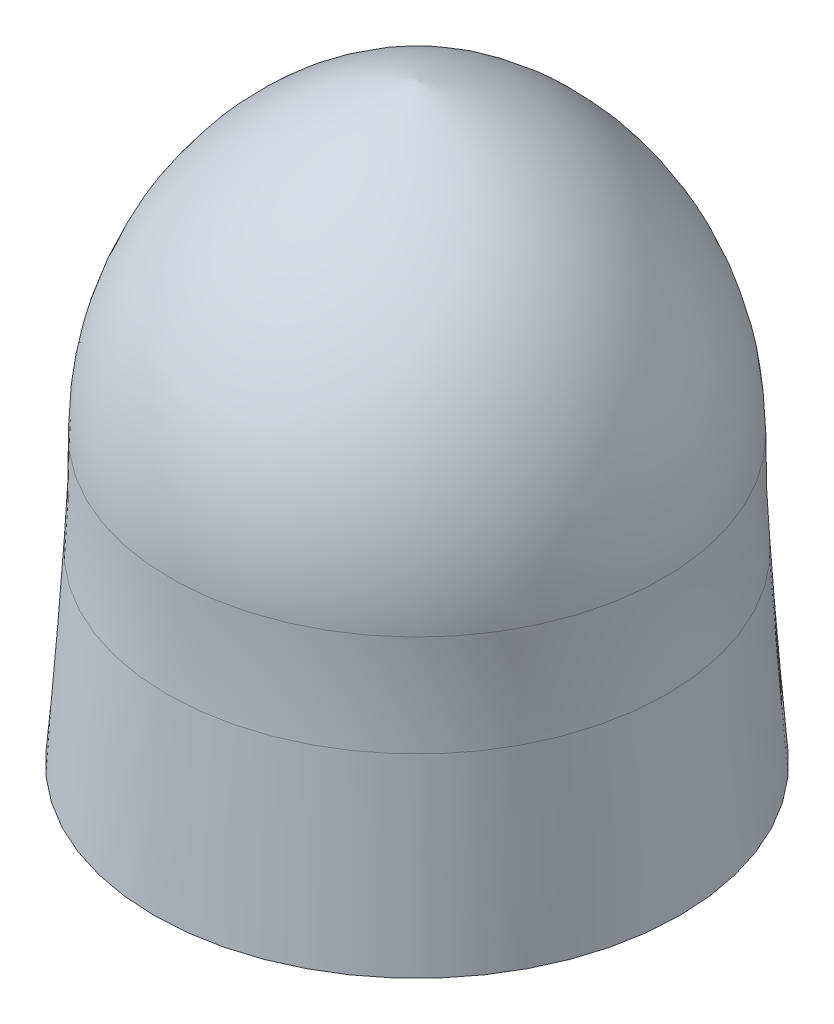
ISO-10303-21;
HEADER;
FILE_DESCRIPTION(('STEP AP214'),'2;1');
FILE_NAME('part.step','',(''),(''),'','','');
FILE_SCHEMA(('AUTOMOTIVE_DESIGN { 1 0 10303 214 1 1 1 1 }'));
ENDSEC;
DATA;
#1=APPLICATION_CONTEXT('core data for automotive mechanical design processes');
#2=APPLICATION_PROTOCOL_DEFINITION('international standard','automotive_design',2000,#1);
#3=PRODUCT_CONTEXT('',#1,'mechanical');
#4=PRODUCT('Part','Part','',(#3));
#5=PRODUCT_RELATED_PRODUCT_CATEGORY('part','',(#4));
#6=PRODUCT_DEFINITION_FORMATION('','',#4);
#7=PRODUCT_DEFINITION_CONTEXT('part definition',#1,'design');
#8=PRODUCT_DEFINITION('design','',#6,#7);
#9=PRODUCT_DEFINITION_SHAPE('','',#8);
#10=(LENGTH_UNIT() NAMED_UNIT(*) SI_UNIT(.MILLI.,.METRE.));
#11=(NAMED_UNIT(*) PLANE_ANGLE_UNIT() SI_UNIT($,.RADIAN.));
#12=(NAMED_UNIT(*) SI_UNIT($,.STERADIAN.) SOLID_ANGLE_UNIT());
#13=UNCERTAINTY_MEASURE_WITH_UNIT(LENGTH_MEASURE(1.E-05),#10,'distance_accuracy_value','');
#14=(GEOMETRIC_REPRESENTATION_CONTEXT(3) GLOBAL_UNCERTAINTY_ASSIGNED_CONTEXT((#13)) GLOBAL_UNIT_ASSIGNED_CONTEXT((#10,
#11,#12)) REPRESENTATION_CONTEXT('',''));
#15=CARTESIAN_POINT('',(0.,0.,0.));
#16=DIRECTION('',(0.,0.,1.));
#17=DIRECTION('',(1.,0.,0.));
#18=AXIS2_PLACEMENT_3D('',#15,#16,#17);
#19=CARTESIAN_POINT('',(10.,-46.48316129116,0.));
#20=DIRECTION('',(0.,0.,-1.));
#21=DIRECTION('',(-1.,0.,0.));
#22=AXIS2_PLACEMENT_3D('',#19,#20,#21);
#23=CIRCLE('',#22,47.5466537583876);
#24=TRIMMED_CURVE('',#23,(PARAMETER_VALUE(-1.35889432008498)),
(PARAMETER_VALUE(1.35889432008498)),.T.,.PARAMETER.);
#25=CARTESIAN_POINT('',(0.,-46.48316129116,0.));
#26=DIRECTION('',(0.,1.,0.));
#27=AXIS1_PLACEMENT('',#25,#26);
#28=SURFACE_OF_REVOLUTION('',#24,#27);
#29=CARTESIAN_POINT('',(0.,-46.7505656060775,0.));
#30=DIRECTION('',(0.,1.,0.));
#31=DIRECTION('',(-1.,0.,0.));
#32=AXIS2_PLACEMENT_3D('',#29,#30,#31);
#33=CIRCLE('',#32,37.545901806069);
#34=CARTESIAN_POINT('',(-37.545901806069,-46.7505656060775,0.));
#35=VERTEX_POINT('',#34);
#36=EDGE_CURVE('E42',#35,#35,#33,.T.);
#37=ORIENTED_EDGE('',*,*,#36,.T.);
#38=EDGE_LOOP('',(#37));
#39=FACE_BOUND('',#38,.T.);
#40=CARTESIAN_POINT('',(0.,0.,0.));
#41=VERTEX_POINT('',#40);
#42=VERTEX_LOOP('',#41);
#43=FACE_BOUND('',#42,.T.);
#44=ADVANCED_FACE('F35',(#39,#43),#28,.T.);
#45=CARTESIAN_POINT('',(0.,-51.3476055698832,0.));
#46=DIRECTION('',(0.,-1.,0.));
#47=DIRECTION('',(1.,0.,0.));
#48=AXIS2_PLACEMENT_3D('',#45,#46,#47);
#49=CONICAL_SURFACE('',#48,37.2971612835188,0.0698131700797734);
#50=CARTESIAN_POINT('',(0.,-61.8266684908287,0.));
#51=DIRECTION('',(0.,-1.,0.));
#52=DIRECTION('',(1.,0.,0.));
#53=AXIS2_PLACEMENT_3D('',#50,#51,#52);
#54=CIRCLE('',#53,38.029928745736);
#55=CARTESIAN_POINT('',(38.029928745736,-61.8266684908287,0.));
#56=VERTEX_POINT('',#55);
#57=EDGE_CURVE('E11',#56,#56,#54,.T.);
#58=ORIENTED_EDGE('',*,*,#57,.T.);
#59=EDGE_LOOP('',(#58));
#60=FACE_BOUND('',#59,.T.);
#61=CARTESIAN_POINT('',(0.,-90.,0.));
#62=DIRECTION('',(0.,1.,0.));
#63=DIRECTION('',(-1.,0.,0.));
#64=AXIS2_PLACEMENT_3D('',#61,#62,#63);
#65=CIRCLE('',#64,40.);
#66=CARTESIAN_POINT('',(-40.,-90.,0.));
#67=VERTEX_POINT('',#66);
#68=EDGE_CURVE('E64',#67,#67,#65,.T.);
#69=ORIENTED_EDGE('',*,*,#68,.T.);
#70=EDGE_LOOP('',(#69));
#71=FACE_BOUND('',#70,.T.);
#72=ADVANCED_FACE('F46',(#60,#71),#49,.T.);
#73=CARTESIAN_POINT('',(-40.,-90.,0.));
#74=DIRECTION('',(0.,-1.,0.));
#75=DIRECTION('',(1.,0.,0.));
#76=AXIS2_PLACEMENT_3D('',#73,#74,#75);
#77=PLANE('',#76);
#78=ORIENTED_EDGE('',*,*,#68,.F.);
#79=EDGE_LOOP('',(#78));
#80=FACE_BOUND('',#79,.T.);
#81=ADVANCED_FACE('F51',(#80),#77,.T.);
#82=CARTESIAN_POINT('',(0.,-47.8753737420037,0.));
#83=DIRECTION('',(0.,1.,0.));
#84=DIRECTION('',(-1.,0.,0.));
#85=AXIS2_PLACEMENT_3D('',#82,#83,#84);
#86=TOROIDAL_SURFACE('',#85,237.542738797701,200.);
#87=ORIENTED_EDGE('',*,*,#57,.F.);
#88=EDGE_LOOP('',(#87));
#89=FACE_BOUND('',#88,.T.);
#90=ORIENTED_EDGE('',*,*,#36,.F.);
#91=EDGE_LOOP('',(#90));
#92=FACE_BOUND('',#91,.T.);
#93=ADVANCED_FACE('F37',(#89,#92),#86,.F.);
#94=CLOSED_SHELL('',(#44,#72,#81,#93));
#95=MANIFOLD_SOLID_BREP('B2',#94);
#96=ADVANCED_BREP_SHAPE_REPRESENTATION('',(#18,#95),#14);
#97=SHAPE_DEFINITION_REPRESENTATION(#9,#96);
ENDSEC;
END-ISO-10303-21;
